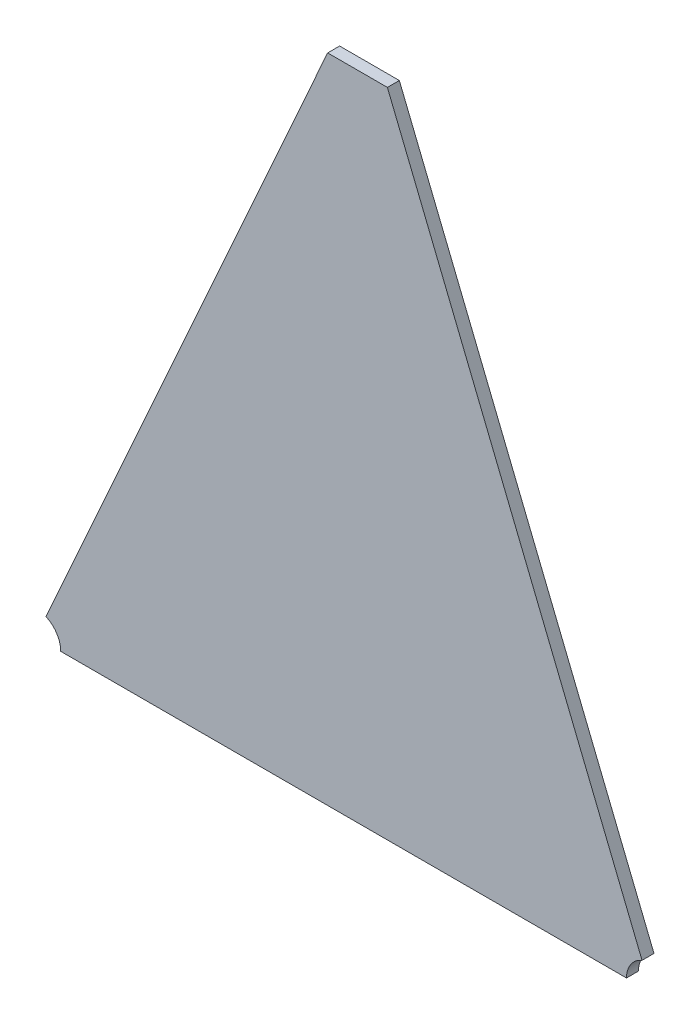
ISO-10303-21;
HEADER;
FILE_DESCRIPTION(('STEP AP214'),'2;1');
FILE_NAME('part.step','',(''),(''),'','','');
FILE_SCHEMA(('AUTOMOTIVE_DESIGN { 1 0 10303 214 1 1 1 1 }'));
ENDSEC;
DATA;
#1=APPLICATION_CONTEXT('core data for automotive mechanical design processes');
#2=APPLICATION_PROTOCOL_DEFINITION('international standard','automotive_design',2000,#1);
#3=PRODUCT_CONTEXT('',#1,'mechanical');
#4=PRODUCT('Part','Part','',(#3));
#5=PRODUCT_RELATED_PRODUCT_CATEGORY('part','',(#4));
#6=PRODUCT_DEFINITION_FORMATION('','',#4);
#7=PRODUCT_DEFINITION_CONTEXT('part definition',#1,'design');
#8=PRODUCT_DEFINITION('design','',#6,#7);
#9=PRODUCT_DEFINITION_SHAPE('','',#8);
#10=(LENGTH_UNIT() NAMED_UNIT(*) SI_UNIT(.MILLI.,.METRE.));
#11=(NAMED_UNIT(*) PLANE_ANGLE_UNIT() SI_UNIT($,.RADIAN.));
#12=(NAMED_UNIT(*) SI_UNIT($,.STERADIAN.) SOLID_ANGLE_UNIT());
#13=UNCERTAINTY_MEASURE_WITH_UNIT(LENGTH_MEASURE(1.E-05),#10,'distance_accuracy_value','');
#14=(GEOMETRIC_REPRESENTATION_CONTEXT(3) GLOBAL_UNCERTAINTY_ASSIGNED_CONTEXT((#13)) GLOBAL_UNIT_ASSIGNED_CONTEXT((#10,
#11,#12)) REPRESENTATION_CONTEXT('',''));
#15=CARTESIAN_POINT('',(0.,0.,0.));
#16=DIRECTION('',(0.,0.,1.));
#17=DIRECTION('',(1.,0.,0.));
#18=AXIS2_PLACEMENT_3D('',#15,#16,#17);
#19=CARTESIAN_POINT('',(-189.740054038778,245.383385713067,7.62));
#20=DIRECTION('',(0.,1.,0.));
#21=DIRECTION('',(0.,0.,1.));
#22=AXIS2_PLACEMENT_3D('',#19,#20,#21);
#23=PLANE('',#22);
#24=DIRECTION('',(1.,0.,0.));
#25=VECTOR('',#24,1.);
#26=CARTESIAN_POINT('',(-189.740054038778,245.383385713067,0.));
#27=LINE('',#26,#25);
#28=CARTESIAN_POINT('',(-189.740054038778,245.383385713067,0.));
#29=VERTEX_POINT('',#28);
#30=CARTESIAN_POINT('',(-151.640054038778,245.383385713067,0.));
#31=VERTEX_POINT('',#30);
#32=EDGE_CURVE('E103',#29,#31,#27,.T.);
#33=ORIENTED_EDGE('',*,*,#32,.F.);
#34=DIRECTION('',(0.,0.,-1.));
#35=VECTOR('',#34,1.);
#36=CARTESIAN_POINT('',(-189.740054038778,245.383385713067,7.62));
#37=LINE('',#36,#35);
#38=CARTESIAN_POINT('',(-189.740054038778,245.383385713067,7.62));
#39=VERTEX_POINT('',#38);
#40=EDGE_CURVE('E11',#39,#29,#37,.T.);
#41=ORIENTED_EDGE('',*,*,#40,.F.);
#42=DIRECTION('',(1.,0.,0.));
#43=VECTOR('',#42,1.);
#44=CARTESIAN_POINT('',(-189.740054038778,245.383385713067,7.62));
#45=LINE('',#44,#43);
#46=CARTESIAN_POINT('',(-151.640054038778,245.383385713067,7.62));
#47=VERTEX_POINT('',#46);
#48=EDGE_CURVE('E112',#39,#47,#45,.T.);
#49=ORIENTED_EDGE('',*,*,#48,.T.);
#50=DIRECTION('',(0.,0.,-1.));
#51=VECTOR('',#50,1.);
#52=CARTESIAN_POINT('',(-151.640054038778,245.383385713067,7.62));
#53=LINE('',#52,#51);
#54=EDGE_CURVE('E35',#47,#31,#53,.T.);
#55=ORIENTED_EDGE('',*,*,#54,.T.);
#56=EDGE_LOOP('',(#33,#41,#49,#55));
#57=FACE_BOUND('',#56,.T.);
#58=ADVANCED_FACE('F32',(#57),#23,.T.);
#59=CARTESIAN_POINT('',(-189.740054038778,245.383385713067,7.62));
#60=DIRECTION('',(0.912692547622784,-0.408646930141206,0.));
#61=DIRECTION('',(0.408646930141206,0.912692547622785,0.));
#62=AXIS2_PLACEMENT_3D('',#59,#60,#61);
#63=PLANE('',#62);
#64=DIRECTION('',(-0.408646930141206,-0.912692547622785,0.));
#65=VECTOR('',#64,1.);
#66=CARTESIAN_POINT('',(-189.740054038778,245.383385713067,0.));
#67=LINE('',#66,#65);
#68=CARTESIAN_POINT('',(-369.421255214335,-155.925620093421,0.));
#69=VERTEX_POINT('',#68);
#70=EDGE_CURVE('E106',#29,#69,#67,.T.);
#71=ORIENTED_EDGE('',*,*,#70,.T.);
#72=DIRECTION('',(0.,0.,-1.));
#73=VECTOR('',#72,1.);
#74=CARTESIAN_POINT('',(-369.421255214335,-155.925620093421,50.8));
#75=LINE('',#74,#73);
#76=CARTESIAN_POINT('',(-369.421255214335,-155.925620093421,7.62));
#77=VERTEX_POINT('',#76);
#78=EDGE_CURVE('E54',#69,#77,#75,.F.);
#79=ORIENTED_EDGE('',*,*,#78,.T.);
#80=DIRECTION('',(-0.408646930141206,-0.912692547622785,0.));
#81=VECTOR('',#80,1.);
#82=CARTESIAN_POINT('',(-189.740054038778,245.383385713067,7.62));
#83=LINE('',#82,#81);
#84=EDGE_CURVE('E124',#39,#77,#83,.T.);
#85=ORIENTED_EDGE('',*,*,#84,.F.);
#86=ORIENTED_EDGE('',*,*,#40,.T.);
#87=EDGE_LOOP('',(#71,#79,#85,#86));
#88=FACE_BOUND('',#87,.T.);
#89=ADVANCED_FACE('F129',(#88),#63,.F.);
#90=CARTESIAN_POINT('',(-375.908525230326,-170.414614286933,7.62));
#91=DIRECTION('',(0.,1.,0.));
#92=DIRECTION('',(-1.,0.,0.));
#93=AXIS2_PLACEMENT_3D('',#90,#91,#92);
#94=PLANE('',#93);
#95=DIRECTION('',(1.,0.,0.));
#96=VECTOR('',#95,1.);
#97=CARTESIAN_POINT('',(-375.908525230326,-170.414614286933,0.));
#98=LINE('',#97,#96);
#99=CARTESIAN_POINT('',(-360.033525230326,-170.414614286933,0.));
#100=VERTEX_POINT('',#99);
#101=CARTESIAN_POINT('',(0.900474769673806,-170.414614286933,0.));
#102=VERTEX_POINT('',#101);
#103=EDGE_CURVE('E104',#100,#102,#98,.T.);
#104=ORIENTED_EDGE('',*,*,#103,.T.);
#105=DIRECTION('',(0.,0.,-1.));
#106=VECTOR('',#105,1.);
#107=CARTESIAN_POINT('',(0.900474769673809,-170.414614286933,50.8));
#108=LINE('',#107,#106);
#109=CARTESIAN_POINT('',(0.900474769673806,-170.414614286933,7.62));
#110=VERTEX_POINT('',#109);
#111=EDGE_CURVE('E46',#102,#110,#108,.F.);
#112=ORIENTED_EDGE('',*,*,#111,.T.);
#113=DIRECTION('',(1.,0.,0.));
#114=VECTOR('',#113,1.);
#115=CARTESIAN_POINT('',(-375.908525230326,-170.414614286933,7.62));
#116=LINE('',#115,#114);
#117=CARTESIAN_POINT('',(-360.033525230326,-170.414614286933,7.62));
#118=VERTEX_POINT('',#117);
#119=EDGE_CURVE('E118',#118,#110,#116,.T.);
#120=ORIENTED_EDGE('',*,*,#119,.F.);
#121=DIRECTION('',(0.,0.,-1.));
#122=VECTOR('',#121,1.);
#123=CARTESIAN_POINT('',(-360.033525230326,-170.414614286933,50.8));
#124=LINE('',#123,#122);
#125=EDGE_CURVE('E138',#118,#100,#124,.T.);
#126=ORIENTED_EDGE('',*,*,#125,.T.);
#127=EDGE_LOOP('',(#104,#112,#120,#126));
#128=FACE_BOUND('',#127,.T.);
#129=ADVANCED_FACE('F141',(#128),#94,.F.);
#130=CARTESIAN_POINT('',(16.7754747696738,-170.414614286933,7.62));
#131=DIRECTION('',(-0.926856595640119,-0.375415571225287,0.));
#132=DIRECTION('',(0.375415571225287,-0.926856595640119,0.));
#133=AXIS2_PLACEMENT_3D('',#130,#131,#132);
#134=PLANE('',#133);
#135=DIRECTION('',(-0.375415571225287,0.926856595640119,0.));
#136=VECTOR('',#135,1.);
#137=CARTESIAN_POINT('',(16.7754747696738,-170.414614286933,7.62));
#138=LINE('',#137,#136);
#139=CARTESIAN_POINT('',(10.8157525764724,-155.700765831146,7.62));
#140=VERTEX_POINT('',#139);
#141=EDGE_CURVE('E97',#140,#47,#138,.T.);
#142=ORIENTED_EDGE('',*,*,#141,.F.);
#143=DIRECTION('',(0.,0.,-1.));
#144=VECTOR('',#143,1.);
#145=CARTESIAN_POINT('',(10.8157525764724,-155.700765831146,50.8));
#146=LINE('',#145,#144);
#147=CARTESIAN_POINT('',(10.8157525764724,-155.700765831146,0.));
#148=VERTEX_POINT('',#147);
#149=EDGE_CURVE('E83',#140,#148,#146,.T.);
#150=ORIENTED_EDGE('',*,*,#149,.T.);
#151=DIRECTION('',(-0.375415571225287,0.926856595640119,0.));
#152=VECTOR('',#151,1.);
#153=CARTESIAN_POINT('',(16.7754747696738,-170.414614286933,0.));
#154=LINE('',#153,#152);
#155=EDGE_CURVE('E95',#148,#31,#154,.T.);
#156=ORIENTED_EDGE('',*,*,#155,.T.);
#157=ORIENTED_EDGE('',*,*,#54,.F.);
#158=EDGE_LOOP('',(#142,#150,#156,#157));
#159=FACE_BOUND('',#158,.T.);
#160=ADVANCED_FACE('F93',(#159),#134,.F.);
#161=CARTESIAN_POINT('',(0.,0.,7.62));
#162=DIRECTION('',(0.,0.,1.));
#163=DIRECTION('',(1.,0.,0.));
#164=AXIS2_PLACEMENT_3D('',#161,#162,#163);
#165=PLANE('',#164);
#166=CARTESIAN_POINT('',(16.7754747696738,-170.414614286933,7.62));
#167=DIRECTION('',(0.,0.,1.));
#168=DIRECTION('',(1.,0.,0.));
#169=AXIS2_PLACEMENT_3D('',#166,#167,#168);
#170=CIRCLE('',#169,15.875);
#171=EDGE_CURVE('E89',#140,#110,#170,.T.);
#172=ORIENTED_EDGE('',*,*,#171,.F.);
#173=ORIENTED_EDGE('',*,*,#141,.T.);
#174=ORIENTED_EDGE('',*,*,#48,.F.);
#175=ORIENTED_EDGE('',*,*,#84,.T.);
#176=CARTESIAN_POINT('',(-375.908525230326,-170.414614286933,7.62));
#177=DIRECTION('',(0.,0.,1.));
#178=DIRECTION('',(1.,0.,0.));
#179=AXIS2_PLACEMENT_3D('',#176,#177,#178);
#180=CIRCLE('',#179,15.875);
#181=EDGE_CURVE('E137',#118,#77,#180,.T.);
#182=ORIENTED_EDGE('',*,*,#181,.F.);
#183=ORIENTED_EDGE('',*,*,#119,.T.);
#184=EDGE_LOOP('',(#172,#173,#174,#175,#182,#183));
#185=FACE_BOUND('',#184,.T.);
#186=ADVANCED_FACE('F130',(#185),#165,.T.);
#187=CARTESIAN_POINT('',(0.,0.,0.));
#188=DIRECTION('',(0.,0.,1.));
#189=DIRECTION('',(1.,0.,0.));
#190=AXIS2_PLACEMENT_3D('',#187,#188,#189);
#191=PLANE('',#190);
#192=ORIENTED_EDGE('',*,*,#155,.F.);
#193=CARTESIAN_POINT('',(16.7754747696738,-170.414614286933,0.));
#194=DIRECTION('',(0.,0.,-1.));
#195=DIRECTION('',(-1.,0.,0.));
#196=AXIS2_PLACEMENT_3D('',#193,#194,#195);
#197=CIRCLE('',#196,15.875);
#198=EDGE_CURVE('E80',#102,#148,#197,.T.);
#199=ORIENTED_EDGE('',*,*,#198,.F.);
#200=ORIENTED_EDGE('',*,*,#103,.F.);
#201=CARTESIAN_POINT('',(-375.908525230326,-170.414614286933,0.));
#202=DIRECTION('',(0.,0.,-1.));
#203=DIRECTION('',(-1.,0.,0.));
#204=AXIS2_PLACEMENT_3D('',#201,#202,#203);
#205=CIRCLE('',#204,15.875);
#206=EDGE_CURVE('E135',#69,#100,#205,.T.);
#207=ORIENTED_EDGE('',*,*,#206,.F.);
#208=ORIENTED_EDGE('',*,*,#70,.F.);
#209=ORIENTED_EDGE('',*,*,#32,.T.);
#210=EDGE_LOOP('',(#192,#199,#200,#207,#208,#209));
#211=FACE_BOUND('',#210,.T.);
#212=ADVANCED_FACE('F100',(#211),#191,.F.);
#213=CARTESIAN_POINT('',(-375.908525230326,-170.414614286933,50.8));
#214=DIRECTION('',(0.,0.,-1.));
#215=DIRECTION('',(-1.,0.,0.));
#216=AXIS2_PLACEMENT_3D('',#213,#214,#215);
#217=CYLINDRICAL_SURFACE('',#216,15.875);
#218=ORIENTED_EDGE('',*,*,#206,.T.);
#219=ORIENTED_EDGE('',*,*,#125,.F.);
#220=ORIENTED_EDGE('',*,*,#181,.T.);
#221=ORIENTED_EDGE('',*,*,#78,.F.);
#222=EDGE_LOOP('',(#218,#219,#220,#221));
#223=FACE_BOUND('',#222,.T.);
#224=ADVANCED_FACE('F142',(#223),#217,.F.);
#225=CARTESIAN_POINT('',(16.7754747696738,-170.414614286933,50.8));
#226=DIRECTION('',(0.,0.,-1.));
#227=DIRECTION('',(-1.,0.,0.));
#228=AXIS2_PLACEMENT_3D('',#225,#226,#227);
#229=CYLINDRICAL_SURFACE('',#228,15.875);
#230=ORIENTED_EDGE('',*,*,#198,.T.);
#231=ORIENTED_EDGE('',*,*,#149,.F.);
#232=ORIENTED_EDGE('',*,*,#171,.T.);
#233=ORIENTED_EDGE('',*,*,#111,.F.);
#234=EDGE_LOOP('',(#230,#231,#232,#233));
#235=FACE_BOUND('',#234,.T.);
#236=ADVANCED_FACE('F82',(#235),#229,.F.);
#237=CLOSED_SHELL('',(#58,#89,#129,#160,#186,#212,#224,#236));
#238=MANIFOLD_SOLID_BREP('B2',#237);
#239=ADVANCED_BREP_SHAPE_REPRESENTATION('',(#18,#238),#14);
#240=SHAPE_DEFINITION_REPRESENTATION(#9,#239);
ENDSEC;
END-ISO-10303-21;
